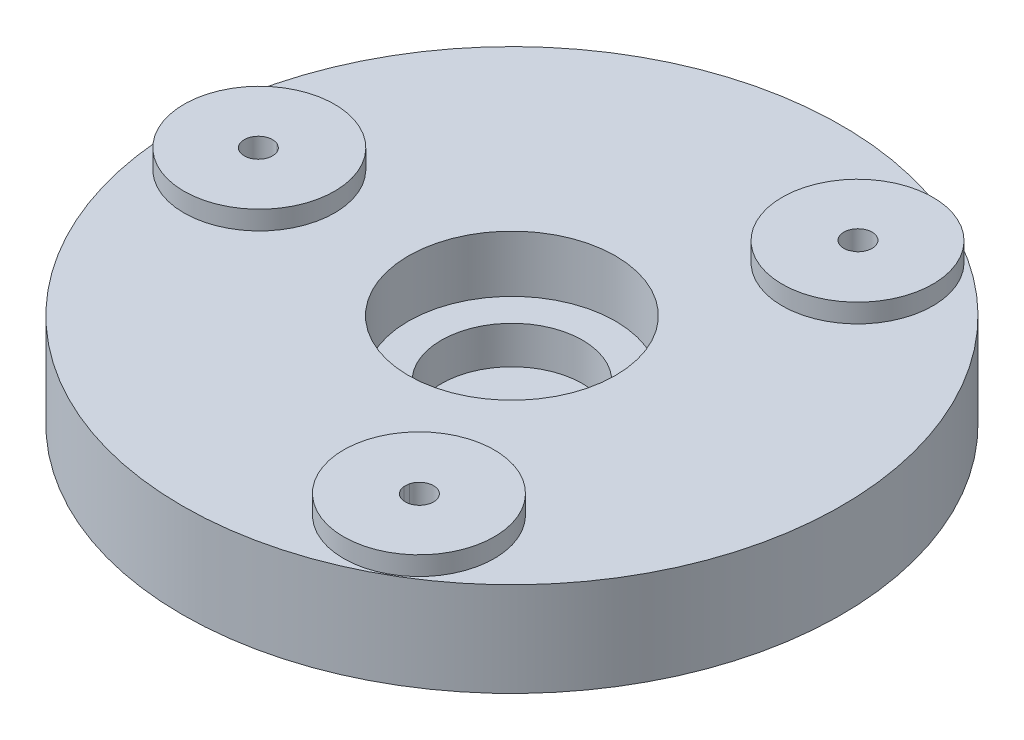
ISO-10303-21;
HEADER;
FILE_DESCRIPTION(('STEP AP214'),'2;1');
FILE_NAME('part.step','',(''),(''),'','','');
FILE_SCHEMA(('AUTOMOTIVE_DESIGN { 1 0 10303 214 1 1 1 1 }'));
ENDSEC;
DATA;
#1=APPLICATION_CONTEXT('core data for automotive mechanical design processes');
#2=APPLICATION_PROTOCOL_DEFINITION('international standard','automotive_design',2000,#1);
#3=PRODUCT_CONTEXT('',#1,'mechanical');
#4=PRODUCT('Part','Part','',(#3));
#5=PRODUCT_RELATED_PRODUCT_CATEGORY('part','',(#4));
#6=PRODUCT_DEFINITION_FORMATION('','',#4);
#7=PRODUCT_DEFINITION_CONTEXT('part definition',#1,'design');
#8=PRODUCT_DEFINITION('design','',#6,#7);
#9=PRODUCT_DEFINITION_SHAPE('','',#8);
#10=(LENGTH_UNIT() NAMED_UNIT(*) SI_UNIT(.MILLI.,.METRE.));
#11=(NAMED_UNIT(*) PLANE_ANGLE_UNIT() SI_UNIT($,.RADIAN.));
#12=(NAMED_UNIT(*) SI_UNIT($,.STERADIAN.) SOLID_ANGLE_UNIT());
#13=UNCERTAINTY_MEASURE_WITH_UNIT(LENGTH_MEASURE(1.E-05),#10,'distance_accuracy_value','');
#14=(GEOMETRIC_REPRESENTATION_CONTEXT(3) GLOBAL_UNCERTAINTY_ASSIGNED_CONTEXT((#13)) GLOBAL_UNIT_ASSIGNED_CONTEXT((#10,
#11,#12)) REPRESENTATION_CONTEXT('',''));
#15=CARTESIAN_POINT('',(0.,0.,0.));
#16=DIRECTION('',(0.,0.,1.));
#17=DIRECTION('',(1.,0.,0.));
#18=AXIS2_PLACEMENT_3D('',#15,#16,#17);
#19=CARTESIAN_POINT('',(0.,-20.,0.));
#20=DIRECTION('',(0.,1.,0.));
#21=DIRECTION('',(0.,0.,1.));
#22=AXIS2_PLACEMENT_3D('',#19,#20,#21);
#23=CYLINDRICAL_SURFACE('',#22,8.96564527824996);
#24=CARTESIAN_POINT('',(0.,-20.,0.));
#25=DIRECTION('',(0.,-1.,0.));
#26=DIRECTION('',(0.,0.,-1.));
#27=AXIS2_PLACEMENT_3D('',#24,#25,#26);
#28=CIRCLE('',#27,8.96564527824996);
#29=CARTESIAN_POINT('',(8.90970231014515,-20.,1.));
#30=VERTEX_POINT('',#29);
#31=CARTESIAN_POINT('',(8.90970231014515,-20.,-1.));
#32=VERTEX_POINT('',#31);
#33=EDGE_CURVE('E62',#30,#32,#28,.T.);
#34=ORIENTED_EDGE('',*,*,#33,.F.);
#35=DIRECTION('',(0.,1.,0.));
#36=VECTOR('',#35,1.);
#37=CARTESIAN_POINT('',(8.90970231014515,-20.,1.));
#38=LINE('',#37,#36);
#39=CARTESIAN_POINT('',(8.90970231014515,-10.,1.));
#40=VERTEX_POINT('',#39);
#41=EDGE_CURVE('E120',#30,#40,#38,.T.);
#42=ORIENTED_EDGE('',*,*,#41,.T.);
#43=CARTESIAN_POINT('',(0.,-10.,0.));
#44=DIRECTION('',(0.,-1.,0.));
#45=DIRECTION('',(0.,0.,-1.));
#46=AXIS2_PLACEMENT_3D('',#43,#44,#45);
#47=CIRCLE('',#46,8.96564527824996);
#48=CARTESIAN_POINT('',(8.90970231014515,-10.,-1.));
#49=VERTEX_POINT('',#48);
#50=EDGE_CURVE('E122',#40,#49,#47,.T.);
#51=ORIENTED_EDGE('',*,*,#50,.T.);
#52=DIRECTION('',(0.,1.,0.));
#53=VECTOR('',#52,1.);
#54=CARTESIAN_POINT('',(8.90970231014515,-20.,-1.));
#55=LINE('',#54,#53);
#56=EDGE_CURVE('E69',#49,#32,#55,.F.);
#57=ORIENTED_EDGE('',*,*,#56,.T.);
#58=EDGE_LOOP('',(#34,#42,#51,#57));
#59=FACE_BOUND('',#58,.T.);
#60=ADVANCED_FACE('F55',(#59),#23,.T.);
#61=CARTESIAN_POINT('',(0.,-20.,0.));
#62=DIRECTION('',(0.,-1.,0.));
#63=DIRECTION('',(0.,0.,-1.));
#64=AXIS2_PLACEMENT_3D('',#61,#62,#63);
#65=PLANE('',#64);
#66=DIRECTION('',(-1.,0.,0.));
#67=VECTOR('',#66,1.);
#68=CARTESIAN_POINT('',(9.96564527824996,-20.,1.));
#69=LINE('',#68,#67);
#70=CARTESIAN_POINT('',(7.96564527824996,-20.,1.));
#71=VERTEX_POINT('',#70);
#72=EDGE_CURVE('E111',#30,#71,#69,.T.);
#73=ORIENTED_EDGE('',*,*,#72,.F.);
#74=ORIENTED_EDGE('',*,*,#33,.T.);
#75=DIRECTION('',(1.,0.,0.));
#76=VECTOR('',#75,1.);
#77=CARTESIAN_POINT('',(9.96564527824996,-20.,-1.));
#78=LINE('',#77,#76);
#79=CARTESIAN_POINT('',(7.96564527824996,-20.,-1.));
#80=VERTEX_POINT('',#79);
#81=EDGE_CURVE('E113',#80,#32,#78,.T.);
#82=ORIENTED_EDGE('',*,*,#81,.F.);
#83=DIRECTION('',(0.,0.,-1.));
#84=VECTOR('',#83,1.);
#85=CARTESIAN_POINT('',(7.96564527824996,-20.,-1.));
#86=LINE('',#85,#84);
#87=EDGE_CURVE('E100',#71,#80,#86,.T.);
#88=ORIENTED_EDGE('',*,*,#87,.F.);
#89=EDGE_LOOP('',(#73,#74,#82,#88));
#90=FACE_BOUND('',#89,.T.);
#91=ADVANCED_FACE('F129',(#90),#65,.T.);
#92=CARTESIAN_POINT('',(0.,-10.,0.));
#93=DIRECTION('',(0.,-1.,0.));
#94=DIRECTION('',(0.,0.,-1.));
#95=AXIS2_PLACEMENT_3D('',#92,#93,#94);
#96=PLANE('',#95);
#97=ORIENTED_EDGE('',*,*,#50,.F.);
#98=DIRECTION('',(-1.,0.,0.));
#99=VECTOR('',#98,1.);
#100=CARTESIAN_POINT('',(0.,-10.,1.));
#101=LINE('',#100,#99);
#102=CARTESIAN_POINT('',(7.96564527824996,-10.,1.));
#103=VERTEX_POINT('',#102);
#104=EDGE_CURVE('E12',#40,#103,#101,.T.);
#105=ORIENTED_EDGE('',*,*,#104,.T.);
#106=DIRECTION('',(0.,0.,-1.));
#107=VECTOR('',#106,1.);
#108=CARTESIAN_POINT('',(7.96564527824996,-10.,-1.));
#109=LINE('',#108,#107);
#110=CARTESIAN_POINT('',(7.96564527824996,-10.,-1.));
#111=VERTEX_POINT('',#110);
#112=EDGE_CURVE('E98',#103,#111,#109,.T.);
#113=ORIENTED_EDGE('',*,*,#112,.T.);
#114=DIRECTION('',(1.,0.,0.));
#115=VECTOR('',#114,1.);
#116=CARTESIAN_POINT('',(9.96564527824996,-10.,-1.));
#117=LINE('',#116,#115);
#118=EDGE_CURVE('E103',#111,#49,#117,.T.);
#119=ORIENTED_EDGE('',*,*,#118,.T.);
#120=EDGE_LOOP('',(#97,#105,#113,#119));
#121=FACE_BOUND('',#120,.T.);
#122=ADVANCED_FACE('F110',(#121),#96,.F.);
#123=CARTESIAN_POINT('',(9.96564527824996,-10.,1.));
#124=DIRECTION('',(0.,0.,1.));
#125=DIRECTION('',(1.,0.,0.));
#126=AXIS2_PLACEMENT_3D('',#123,#124,#125);
#127=PLANE('',#126);
#128=ORIENTED_EDGE('',*,*,#72,.T.);
#129=DIRECTION('',(0.,-1.,0.));
#130=VECTOR('',#129,1.);
#131=CARTESIAN_POINT('',(7.96564527824996,-10.,1.));
#132=LINE('',#131,#130);
#133=EDGE_CURVE('E102',#103,#71,#132,.T.);
#134=ORIENTED_EDGE('',*,*,#133,.F.);
#135=ORIENTED_EDGE('',*,*,#104,.F.);
#136=ORIENTED_EDGE('',*,*,#41,.F.);
#137=EDGE_LOOP('',(#128,#134,#135,#136));
#138=FACE_BOUND('',#137,.T.);
#139=ADVANCED_FACE('F127',(#138),#127,.F.);
#140=CARTESIAN_POINT('',(9.96564527824996,-10.,-1.));
#141=DIRECTION('',(0.,0.,-1.));
#142=DIRECTION('',(-1.,0.,0.));
#143=AXIS2_PLACEMENT_3D('',#140,#141,#142);
#144=PLANE('',#143);
#145=ORIENTED_EDGE('',*,*,#118,.F.);
#146=DIRECTION('',(0.,-1.,0.));
#147=VECTOR('',#146,1.);
#148=CARTESIAN_POINT('',(7.96564527824996,-10.,-1.));
#149=LINE('',#148,#147);
#150=EDGE_CURVE('E94',#111,#80,#149,.T.);
#151=ORIENTED_EDGE('',*,*,#150,.T.);
#152=ORIENTED_EDGE('',*,*,#81,.T.);
#153=ORIENTED_EDGE('',*,*,#56,.F.);
#154=EDGE_LOOP('',(#145,#151,#152,#153));
#155=FACE_BOUND('',#154,.T.);
#156=ADVANCED_FACE('F105',(#155),#144,.F.);
#157=CARTESIAN_POINT('',(7.96564527824996,-10.,-1.));
#158=DIRECTION('',(-1.,0.,0.));
#159=DIRECTION('',(0.,0.,1.));
#160=AXIS2_PLACEMENT_3D('',#157,#158,#159);
#161=PLANE('',#160);
#162=ORIENTED_EDGE('',*,*,#87,.T.);
#163=ORIENTED_EDGE('',*,*,#150,.F.);
#164=ORIENTED_EDGE('',*,*,#112,.F.);
#165=ORIENTED_EDGE('',*,*,#133,.T.);
#166=EDGE_LOOP('',(#162,#163,#164,#165));
#167=FACE_BOUND('',#166,.T.);
#168=ADVANCED_FACE('F95',(#167),#161,.F.);
#169=CLOSED_SHELL('',(#60,#91,#122,#139,#156,#168));
#170=MANIFOLD_SOLID_BREP('B2',#169);
#171=CARTESIAN_POINT('',(-26.906498574434,-19.,0.0179362867608335));
#172=DIRECTION('',(0.,1.,0.));
#173=DIRECTION('',(0.,0.,1.));
#174=AXIS2_PLACEMENT_3D('',#171,#172,#173);
#175=CYLINDRICAL_SURFACE('',#174,1.5);
#176=CARTESIAN_POINT('',(-26.906498574434,-6.00000000000001,0.0179362867608335));
#177=DIRECTION('',(0.,-1.,0.));
#178=DIRECTION('',(0.,0.,-1.));
#179=AXIS2_PLACEMENT_3D('',#176,#177,#178);
#180=CIRCLE('',#179,1.5);
#181=CARTESIAN_POINT('',(-26.2764467646304,-6.00000000000001,-1.34332589113262));
#182=VERTEX_POINT('',#181);
#183=CARTESIAN_POINT('',(-25.8571119358385,-6.00000000000001,-1.05387884782966));
#184=VERTEX_POINT('',#183);
#185=EDGE_CURVE('E192',#182,#184,#180,.F.);
#186=ORIENTED_EDGE('',*,*,#185,.F.);
#187=DIRECTION('',(0.,1.,0.));
#188=VECTOR('',#187,1.);
#189=CARTESIAN_POINT('',(-26.2764467646304,-19.,-1.34332589113262));
#190=LINE('',#189,#188);
#191=CARTESIAN_POINT('',(-26.2764467646304,2.,-1.34332589113262));
#192=VERTEX_POINT('',#191);
#193=EDGE_CURVE('E266',#182,#192,#190,.T.);
#194=ORIENTED_EDGE('',*,*,#193,.T.);
#195=CARTESIAN_POINT('',(-26.906498574434,2.,0.0179362867608335));
#196=DIRECTION('',(0.,1.,0.));
#197=DIRECTION('',(0.866025403784436,0.,-0.500000000000004));
#198=AXIS2_PLACEMENT_3D('',#195,#196,#197);
#199=CIRCLE('',#198,1.5);
#200=CARTESIAN_POINT('',(-25.8571119358385,2.,-1.05387884782966));
#201=VERTEX_POINT('',#200);
#202=EDGE_CURVE('E244',#192,#201,#199,.T.);
#203=ORIENTED_EDGE('',*,*,#202,.T.);
#204=DIRECTION('',(0.,1.,0.));
#205=VECTOR('',#204,1.);
#206=CARTESIAN_POINT('',(-25.8571119358385,-19.,-1.05387884782966));
#207=LINE('',#206,#205);
#208=EDGE_CURVE('E700',#184,#201,#207,.T.);
#209=ORIENTED_EDGE('',*,*,#208,.F.);
#210=EDGE_LOOP('',(#186,#194,#203,#209));
#211=FACE_BOUND('',#210,.T.);
#212=ADVANCED_FACE('F178',(#211),#175,.F.);
#213=CARTESIAN_POINT('',(-7.85137258717134,-19.,11.3746333078864));
#214=DIRECTION('',(-0.568066221964961,0.,0.822982847611331));
#215=DIRECTION('',(0.822982847611331,0.,0.568066221964961));
#216=AXIS2_PLACEMENT_3D('',#213,#214,#215);
#217=PLANE('',#216);
#218=ORIENTED_EDGE('',*,*,#193,.F.);
#219=DIRECTION('',(0.822982847611331,0.,0.568066221964961));
#220=VECTOR('',#219,1.);
#221=CARTESIAN_POINT('',(-7.85137258717134,-6.00000000000001,11.3746333078864));
#222=LINE('',#221,#220);
#223=EDGE_CURVE('E53',#182,#184,#222,.T.);
#224=ORIENTED_EDGE('',*,*,#223,.T.);
#225=ORIENTED_EDGE('',*,*,#208,.T.);
#226=DIRECTION('',(0.822982847611331,0.,0.568066221964961));
#227=VECTOR('',#226,1.);
#228=CARTESIAN_POINT('',(-7.85137258717134,2.,11.3746333078864));
#229=LINE('',#228,#227);
#230=EDGE_CURVE('E247',#192,#201,#229,.T.);
#231=ORIENTED_EDGE('',*,*,#230,.F.);
#232=EDGE_LOOP('',(#218,#224,#225,#231));
#233=FACE_BOUND('',#232,.T.);
#234=ADVANCED_FACE('F355',(#233),#217,.T.);
#235=CARTESIAN_POINT('',(13.4687825672016,-19.,23.2927431489692));
#236=DIRECTION('',(0.,1.,0.));
#237=DIRECTION('',(0.,0.,1.));
#238=AXIS2_PLACEMENT_3D('',#235,#236,#237);
#239=CYLINDRICAL_SURFACE('',#238,1.5);
#240=CARTESIAN_POINT('',(13.4687825672016,-6.00000000000001,23.2927431489692));
#241=DIRECTION('',(0.,-1.,0.));
#242=DIRECTION('',(0.,0.,-1.));
#243=AXIS2_PLACEMENT_3D('',#240,#241,#242);
#244=CIRCLE('',#243,1.5);
#245=CARTESIAN_POINT('',(11.9748690350331,-6.00000000000001,23.4277333649256));
#246=VERTEX_POINT('',#245);
#247=CARTESIAN_POINT('',(12.0158701131878,-6.00000000000001,22.9198552288487));
#248=VERTEX_POINT('',#247);
#249=EDGE_CURVE('E198',#246,#248,#244,.F.);
#250=ORIENTED_EDGE('',*,*,#249,.F.);
#251=DIRECTION('',(0.,1.,0.));
#252=VECTOR('',#251,1.);
#253=CARTESIAN_POINT('',(11.9748690350331,-19.,23.4277333649256));
#254=LINE('',#253,#252);
#255=CARTESIAN_POINT('',(11.9748690350331,2.,23.4277333649256));
#256=VERTEX_POINT('',#255);
#257=EDGE_CURVE('E235',#246,#256,#254,.T.);
#258=ORIENTED_EDGE('',*,*,#257,.T.);
#259=CARTESIAN_POINT('',(13.4687825672016,2.,23.2927431489692));
#260=DIRECTION('',(0.,1.,0.));
#261=DIRECTION('',(-0.866025403784443,0.,-0.499999999999992));
#262=AXIS2_PLACEMENT_3D('',#259,#260,#261);
#263=CIRCLE('',#262,1.5);
#264=CARTESIAN_POINT('',(12.0158701131878,2.,22.9198552288487));
#265=VERTEX_POINT('',#264);
#266=EDGE_CURVE('E695',#256,#265,#263,.T.);
#267=ORIENTED_EDGE('',*,*,#266,.T.);
#268=DIRECTION('',(0.,1.,0.));
#269=VECTOR('',#268,1.);
#270=CARTESIAN_POINT('',(12.0158701131878,-19.,22.9198552288487));
#271=LINE('',#270,#269);
#272=EDGE_CURVE('E237',#248,#265,#271,.T.);
#273=ORIENTED_EDGE('',*,*,#272,.F.);
#274=EDGE_LOOP('',(#250,#258,#267,#273));
#275=FACE_BOUND('',#274,.T.);
#276=ADVANCED_FACE('F233',(#275),#239,.F.);
#277=CARTESIAN_POINT('',(13.7764076969479,-19.,1.11217146112389));
#278=DIRECTION('',(0.996757163892751,0.,0.0804683554478362));
#279=DIRECTION('',(0.0804683554478362,0.,-0.996757163892751));
#280=AXIS2_PLACEMENT_3D('',#277,#278,#279);
#281=PLANE('',#280);
#282=ORIENTED_EDGE('',*,*,#257,.F.);
#283=DIRECTION('',(0.0804683554478362,0.,-0.996757163892751));
#284=VECTOR('',#283,1.);
#285=CARTESIAN_POINT('',(13.7764076969479,-6.00000000000001,1.11217146112389));
#286=LINE('',#285,#284);
#287=EDGE_CURVE('E186',#246,#248,#286,.T.);
#288=ORIENTED_EDGE('',*,*,#287,.T.);
#289=ORIENTED_EDGE('',*,*,#272,.T.);
#290=DIRECTION('',(0.0804683554478362,0.,-0.996757163892751));
#291=VECTOR('',#290,1.);
#292=CARTESIAN_POINT('',(13.7764076969479,2.,1.11217146112389));
#293=LINE('',#292,#291);
#294=EDGE_CURVE('E242',#256,#265,#293,.T.);
#295=ORIENTED_EDGE('',*,*,#294,.F.);
#296=EDGE_LOOP('',(#282,#288,#289,#295));
#297=FACE_BOUND('',#296,.T.);
#298=ADVANCED_FACE('F240',(#297),#281,.T.);
#299=CARTESIAN_POINT('',(13.4377160072327,-19.,-23.31067943573));
#300=DIRECTION('',(0.,1.,0.));
#301=DIRECTION('',(0.,0.,1.));
#302=AXIS2_PLACEMENT_3D('',#299,#300,#301);
#303=CYLINDRICAL_SURFACE('',#302,1.5);
#304=CARTESIAN_POINT('',(13.4377160072327,-6.00000000000001,-23.31067943573));
#305=DIRECTION('',(0.,-1.,0.));
#306=DIRECTION('',(0.,0.,-1.));
#307=AXIS2_PLACEMENT_3D('',#304,#305,#306);
#308=CIRCLE('',#307,1.5);
#309=CARTESIAN_POINT('',(14.3015777295975,-6.00000000000001,-22.084407473793));
#310=VERTEX_POINT('',#309);
#311=CARTESIAN_POINT('',(13.8412418226509,-6.00000000000001,-21.8659763810191));
#312=VERTEX_POINT('',#311);
#313=EDGE_CURVE('E270',#310,#312,#308,.F.);
#314=ORIENTED_EDGE('',*,*,#313,.F.);
#315=DIRECTION('',(0.,1.,0.));
#316=VECTOR('',#315,1.);
#317=CARTESIAN_POINT('',(14.3015777295975,-19.,-22.084407473793));
#318=LINE('',#317,#316);
#319=CARTESIAN_POINT('',(14.3015777295975,2.,-22.084407473793));
#320=VERTEX_POINT('',#319);
#321=EDGE_CURVE('E281',#310,#320,#318,.T.);
#322=ORIENTED_EDGE('',*,*,#321,.T.);
#323=CARTESIAN_POINT('',(13.4377160072327,2.,-23.31067943573));
#324=DIRECTION('',(0.,1.,0.));
#325=DIRECTION('',(0.,0.,1.));
#326=AXIS2_PLACEMENT_3D('',#323,#324,#325);
#327=CIRCLE('',#326,1.5);
#328=CARTESIAN_POINT('',(13.8412418226509,2.,-21.8659763810191));
#329=VERTEX_POINT('',#328);
#330=EDGE_CURVE('E274',#320,#329,#327,.T.);
#331=ORIENTED_EDGE('',*,*,#330,.T.);
#332=DIRECTION('',(0.,1.,0.));
#333=VECTOR('',#332,1.);
#334=CARTESIAN_POINT('',(13.8412418226509,-19.,-21.8659763810191));
#335=LINE('',#334,#333);
#336=EDGE_CURVE('E280',#312,#329,#335,.T.);
#337=ORIENTED_EDGE('',*,*,#336,.F.);
#338=EDGE_LOOP('',(#314,#322,#331,#337));
#339=FACE_BOUND('',#338,.T.);
#340=ADVANCED_FACE('F317',(#339),#303,.F.);
#341=CARTESIAN_POINT('',(-5.92503510977647,-19.,-12.4868047690103));
#342=DIRECTION('',(-0.428690941927785,0.,-0.903451203059174));
#343=DIRECTION('',(-0.903451203059174,0.,0.428690941927785));
#344=AXIS2_PLACEMENT_3D('',#341,#342,#343);
#345=PLANE('',#344);
#346=ORIENTED_EDGE('',*,*,#321,.F.);
#347=DIRECTION('',(-0.903451203059174,0.,0.428690941927785));
#348=VECTOR('',#347,1.);
#349=CARTESIAN_POINT('',(-5.92503510977647,-6.00000000000001,-12.4868047690103));
#350=LINE('',#349,#348);
#351=EDGE_CURVE('E231',#310,#312,#350,.T.);
#352=ORIENTED_EDGE('',*,*,#351,.T.);
#353=ORIENTED_EDGE('',*,*,#336,.T.);
#354=DIRECTION('',(-0.903451203059174,0.,0.428690941927785));
#355=VECTOR('',#354,1.);
#356=CARTESIAN_POINT('',(-5.92503510977647,2.,-12.4868047690103));
#357=LINE('',#356,#355);
#358=EDGE_CURVE('E277',#320,#329,#357,.T.);
#359=ORIENTED_EDGE('',*,*,#358,.F.);
#360=EDGE_LOOP('',(#346,#352,#353,#359));
#361=FACE_BOUND('',#360,.T.);
#362=ADVANCED_FACE('F312',(#361),#345,.T.);
#363=CARTESIAN_POINT('',(0.,-10.,0.));
#364=DIRECTION('',(0.,1.,0.));
#365=DIRECTION('',(0.,0.,1.));
#366=AXIS2_PLACEMENT_3D('',#363,#364,#365);
#367=CYLINDRICAL_SURFACE('',#366,35.);
#368=CARTESIAN_POINT('',(0.,-10.,0.));
#369=DIRECTION('',(0.,1.,0.));
#370=DIRECTION('',(0.,0.,1.));
#371=AXIS2_PLACEMENT_3D('',#368,#369,#370);
#372=CIRCLE('',#371,35.);
#373=CARTESIAN_POINT('',(0.,-10.,35.));
#374=VERTEX_POINT('',#373);
#375=EDGE_CURVE('E301',#374,#374,#372,.T.);
#376=ORIENTED_EDGE('',*,*,#375,.T.);
#377=EDGE_LOOP('',(#376));
#378=FACE_BOUND('',#377,.T.);
#379=CARTESIAN_POINT('',(0.,0.,0.));
#380=DIRECTION('',(0.,1.,0.));
#381=DIRECTION('',(0.,0.,1.));
#382=AXIS2_PLACEMENT_3D('',#379,#380,#381);
#383=CIRCLE('',#382,35.);
#384=CARTESIAN_POINT('',(0.,0.,35.));
#385=VERTEX_POINT('',#384);
#386=EDGE_CURVE('E297',#385,#385,#383,.T.);
#387=ORIENTED_EDGE('',*,*,#386,.F.);
#388=EDGE_LOOP('',(#387));
#389=FACE_BOUND('',#388,.T.);
#390=ADVANCED_FACE('F180',(#378,#389),#367,.T.);
#391=CARTESIAN_POINT('',(0.,-10.,0.));
#392=DIRECTION('',(0.,1.,0.));
#393=DIRECTION('',(0.,0.,1.));
#394=AXIS2_PLACEMENT_3D('',#391,#392,#393);
#395=PLANE('',#394);
#396=CARTESIAN_POINT('',(0.0179362867609341,-10.,26.906498574434));
#397=DIRECTION('',(0.,-1.,0.));
#398=DIRECTION('',(0.500000000000007,0.,0.866025403784435));
#399=AXIS2_PLACEMENT_3D('',#396,#397,#398);
#400=CIRCLE('',#399,3.1);
#401=CARTESIAN_POINT('',(1.56793628676096,-10.,29.5911773261658));
#402=VERTEX_POINT('',#401);
#403=EDGE_CURVE('E651',#402,#402,#400,.T.);
#404=ORIENTED_EDGE('',*,*,#403,.F.);
#405=EDGE_LOOP('',(#404));
#406=FACE_BOUND('',#405,.T.);
#407=CARTESIAN_POINT('',(-23.31067943573,-10.,-13.4377160072326));
#408=DIRECTION('',(0.,-1.,0.));
#409=DIRECTION('',(-1.,0.,0.));
#410=AXIS2_PLACEMENT_3D('',#407,#408,#409);
#411=CIRCLE('',#410,3.1);
#412=CARTESIAN_POINT('',(-26.41067943573,-10.,-13.4377160072326));
#413=VERTEX_POINT('',#412);
#414=EDGE_CURVE('E650',#413,#413,#411,.T.);
#415=ORIENTED_EDGE('',*,*,#414,.F.);
#416=EDGE_LOOP('',(#415));
#417=FACE_BOUND('',#416,.T.);
#418=CARTESIAN_POINT('',(23.3106794357301,-10.,13.4377160072324));
#419=DIRECTION('',(0.,-1.,0.));
#420=DIRECTION('',(1.,0.,0.));
#421=AXIS2_PLACEMENT_3D('',#418,#419,#420);
#422=CIRCLE('',#421,3.1);
#423=CARTESIAN_POINT('',(26.4106794357301,-10.,13.4377160072324));
#424=VERTEX_POINT('',#423);
#425=EDGE_CURVE('E660',#424,#424,#422,.T.);
#426=ORIENTED_EDGE('',*,*,#425,.F.);
#427=EDGE_LOOP('',(#426));
#428=FACE_BOUND('',#427,.T.);
#429=CARTESIAN_POINT('',(-23.2927431489692,-10.,13.4687825672015));
#430=DIRECTION('',(0.,-1.,0.));
#431=DIRECTION('',(-0.499999999999995,0.,0.866025403784441));
#432=AXIS2_PLACEMENT_3D('',#429,#430,#431);
#433=CIRCLE('',#432,3.1);
#434=CARTESIAN_POINT('',(-24.8427431489692,-10.,16.1534613189332));
#435=VERTEX_POINT('',#434);
#436=EDGE_CURVE('E665',#435,#435,#433,.T.);
#437=ORIENTED_EDGE('',*,*,#436,.F.);
#438=EDGE_LOOP('',(#437));
#439=FACE_BOUND('',#438,.T.);
#440=CARTESIAN_POINT('',(-26.906498574434,-10.,0.0179362867608335));
#441=DIRECTION('',(0.,-1.,0.));
#442=DIRECTION('',(-0.866025403784436,0.,0.500000000000004));
#443=AXIS2_PLACEMENT_3D('',#440,#441,#442);
#444=CIRCLE('',#443,3.1);
#445=CARTESIAN_POINT('',(-29.5911773261658,-10.,1.56793628676085));
#446=VERTEX_POINT('',#445);
#447=EDGE_CURVE('E676',#446,#446,#444,.T.);
#448=ORIENTED_EDGE('',*,*,#447,.F.);
#449=EDGE_LOOP('',(#448));
#450=FACE_BOUND('',#449,.T.);
#451=CARTESIAN_POINT('',(13.4687825672016,-10.,23.2927431489692));
#452=DIRECTION('',(0.,-1.,0.));
#453=DIRECTION('',(0.866025403784443,0.,0.499999999999992));
#454=AXIS2_PLACEMENT_3D('',#451,#452,#453);
#455=CIRCLE('',#454,3.1);
#456=CARTESIAN_POINT('',(16.1534613189333,-10.,24.8427431489691));
#457=VERTEX_POINT('',#456);
#458=EDGE_CURVE('E671',#457,#457,#455,.T.);
#459=ORIENTED_EDGE('',*,*,#458,.F.);
#460=EDGE_LOOP('',(#459));
#461=FACE_BOUND('',#460,.T.);
#462=CARTESIAN_POINT('',(23.2927431489693,-10.,-13.4687825672013));
#463=DIRECTION('',(0.,-1.,0.));
#464=DIRECTION('',(0.500000000000001,0.,-0.866025403784438));
#465=AXIS2_PLACEMENT_3D('',#462,#463,#464);
#466=CIRCLE('',#465,3.1);
#467=CARTESIAN_POINT('',(24.8427431489693,-10.,-16.1534613189331));
#468=VERTEX_POINT('',#467);
#469=EDGE_CURVE('E685',#468,#468,#466,.T.);
#470=ORIENTED_EDGE('',*,*,#469,.F.);
#471=EDGE_LOOP('',(#470));
#472=FACE_BOUND('',#471,.T.);
#473=CARTESIAN_POINT('',(-0.0179362867607329,-10.,-26.906498574434));
#474=DIRECTION('',(0.,-1.,0.));
#475=DIRECTION('',(-0.500000000000001,0.,-0.866025403784438));
#476=AXIS2_PLACEMENT_3D('',#473,#474,#475);
#477=CIRCLE('',#476,3.1);
#478=CARTESIAN_POINT('',(-1.56793628676074,-10.,-29.5911773261658));
#479=VERTEX_POINT('',#478);
#480=EDGE_CURVE('E689',#479,#479,#477,.T.);
#481=ORIENTED_EDGE('',*,*,#480,.F.);
#482=EDGE_LOOP('',(#481));
#483=FACE_BOUND('',#482,.T.);
#484=CARTESIAN_POINT('',(13.4377160072327,-10.,-23.31067943573));
#485=DIRECTION('',(0.,-1.,0.));
#486=DIRECTION('',(0.,0.,-1.));
#487=AXIS2_PLACEMENT_3D('',#484,#485,#486);
#488=CIRCLE('',#487,3.1);
#489=CARTESIAN_POINT('',(13.4377160072327,-10.,-26.41067943573));
#490=VERTEX_POINT('',#489);
#491=EDGE_CURVE('E256',#490,#490,#488,.T.);
#492=ORIENTED_EDGE('',*,*,#491,.F.);
#493=EDGE_LOOP('',(#492));
#494=FACE_BOUND('',#493,.T.);
#495=CARTESIAN_POINT('',(0.,-10.,0.));
#496=DIRECTION('',(0.,-1.,0.));
#497=DIRECTION('',(0.,0.,-1.));
#498=AXIS2_PLACEMENT_3D('',#495,#496,#497);
#499=CIRCLE('',#498,7.5);
#500=CARTESIAN_POINT('',(0.,-10.,-7.5));
#501=VERTEX_POINT('',#500);
#502=EDGE_CURVE('E288',#501,#501,#499,.T.);
#503=ORIENTED_EDGE('',*,*,#502,.F.);
#504=EDGE_LOOP('',(#503));
#505=FACE_BOUND('',#504,.T.);
#506=ORIENTED_EDGE('',*,*,#375,.F.);
#507=EDGE_LOOP('',(#506));
#508=FACE_BOUND('',#507,.T.);
#509=ADVANCED_FACE('F338',(#406,#417,#428,#439,#450,#461,#472,#483,#494,#505,#508),#395,.F.);
#510=CARTESIAN_POINT('',(0.,0.,0.));
#511=DIRECTION('',(0.,1.,0.));
#512=DIRECTION('',(0.,0.,1.));
#513=AXIS2_PLACEMENT_3D('',#510,#511,#512);
#514=PLANE('',#513);
#515=CARTESIAN_POINT('',(-26.8595374461574,0.,-0.0303611611849868));
#516=DIRECTION('',(0.,1.,0.));
#517=DIRECTION('',(0.866025403784436,0.,-0.500000000000004));
#518=AXIS2_PLACEMENT_3D('',#515,#516,#517);
#519=CIRCLE('',#518,8.);
#520=CARTESIAN_POINT('',(-19.9313342158819,0.,-4.03036116118502));
#521=VERTEX_POINT('',#520);
#522=EDGE_CURVE('E257',#521,#521,#519,.T.);
#523=ORIENTED_EDGE('',*,*,#522,.F.);
#524=EDGE_LOOP('',(#523));
#525=FACE_BOUND('',#524,.T.);
#526=CARTESIAN_POINT('',(13.4034751862042,0.,23.2762223428642));
#527=DIRECTION('',(0.,1.,0.));
#528=DIRECTION('',(-0.866025403784443,0.,-0.499999999999992));
#529=AXIS2_PLACEMENT_3D('',#526,#527,#528);
#530=CIRCLE('',#529,8.);
#531=CARTESIAN_POINT('',(6.47527195592868,0.,19.2762223428642));
#532=VERTEX_POINT('',#531);
#533=EDGE_CURVE('E263',#532,#532,#530,.T.);
#534=ORIENTED_EDGE('',*,*,#533,.F.);
#535=EDGE_LOOP('',(#534));
#536=FACE_BOUND('',#535,.T.);
#537=CARTESIAN_POINT('',(13.4560622599534,0.,-23.2458611816792));
#538=DIRECTION('',(0.,1.,0.));
#539=DIRECTION('',(0.,0.,1.));
#540=AXIS2_PLACEMENT_3D('',#537,#538,#539);
#541=CIRCLE('',#540,8.);
#542=CARTESIAN_POINT('',(13.4560622599534,0.,-15.2458611816792));
#543=VERTEX_POINT('',#542);
#544=EDGE_CURVE('E283',#543,#543,#541,.T.);
#545=ORIENTED_EDGE('',*,*,#544,.F.);
#546=EDGE_LOOP('',(#545));
#547=FACE_BOUND('',#546,.T.);
#548=CARTESIAN_POINT('',(0.,0.,0.));
#549=DIRECTION('',(0.,1.,0.));
#550=DIRECTION('',(0.,0.,1.));
#551=AXIS2_PLACEMENT_3D('',#548,#549,#550);
#552=CIRCLE('',#551,11.);
#553=CARTESIAN_POINT('',(0.,0.,11.));
#554=VERTEX_POINT('',#553);
#555=EDGE_CURVE('E298',#554,#554,#552,.T.);
#556=ORIENTED_EDGE('',*,*,#555,.F.);
#557=EDGE_LOOP('',(#556));
#558=FACE_BOUND('',#557,.T.);
#559=ORIENTED_EDGE('',*,*,#386,.T.);
#560=EDGE_LOOP('',(#559));
#561=FACE_BOUND('',#560,.T.);
#562=ADVANCED_FACE('F334',(#525,#536,#547,#558,#561),#514,.T.);
#563=CARTESIAN_POINT('',(0.,-5.99999999999999,0.));
#564=DIRECTION('',(0.,1.,0.));
#565=DIRECTION('',(0.,0.,1.));
#566=AXIS2_PLACEMENT_3D('',#563,#564,#565);
#567=CYLINDRICAL_SURFACE('',#566,11.);
#568=CARTESIAN_POINT('',(0.,-5.99999999999999,0.));
#569=DIRECTION('',(0.,1.,0.));
#570=DIRECTION('',(0.,0.,1.));
#571=AXIS2_PLACEMENT_3D('',#568,#569,#570);
#572=CIRCLE('',#571,11.);
#573=CARTESIAN_POINT('',(0.,-5.99999999999999,11.));
#574=VERTEX_POINT('',#573);
#575=EDGE_CURVE('E294',#574,#574,#572,.T.);
#576=ORIENTED_EDGE('',*,*,#575,.F.);
#577=EDGE_LOOP('',(#576));
#578=FACE_BOUND('',#577,.T.);
#579=ORIENTED_EDGE('',*,*,#555,.T.);
#580=EDGE_LOOP('',(#579));
#581=FACE_BOUND('',#580,.T.);
#582=ADVANCED_FACE('F337',(#578,#581),#567,.F.);
#583=CARTESIAN_POINT('',(0.,-5.99999999999999,0.));
#584=DIRECTION('',(0.,1.,0.));
#585=DIRECTION('',(0.,0.,1.));
#586=AXIS2_PLACEMENT_3D('',#583,#584,#585);
#587=PLANE('',#586);
#588=CARTESIAN_POINT('',(0.,-5.99999999999999,0.));
#589=DIRECTION('',(0.,1.,0.));
#590=DIRECTION('',(0.,0.,1.));
#591=AXIS2_PLACEMENT_3D('',#588,#589,#590);
#592=CIRCLE('',#591,7.5);
#593=CARTESIAN_POINT('',(0.,-5.99999999999999,7.5));
#594=VERTEX_POINT('',#593);
#595=EDGE_CURVE('E293',#594,#594,#592,.T.);
#596=ORIENTED_EDGE('',*,*,#595,.F.);
#597=EDGE_LOOP('',(#596));
#598=FACE_BOUND('',#597,.T.);
#599=ORIENTED_EDGE('',*,*,#575,.T.);
#600=EDGE_LOOP('',(#599));
#601=FACE_BOUND('',#600,.T.);
#602=ADVANCED_FACE('F398',(#598,#601),#587,.T.);
#603=CARTESIAN_POINT('',(0.,-4.00000000000001,0.));
#604=DIRECTION('',(0.,-1.,0.));
#605=DIRECTION('',(0.,0.,-1.));
#606=AXIS2_PLACEMENT_3D('',#603,#604,#605);
#607=CYLINDRICAL_SURFACE('',#606,7.5);
#608=ORIENTED_EDGE('',*,*,#595,.T.);
#609=EDGE_LOOP('',(#608));
#610=FACE_BOUND('',#609,.T.);
#611=ORIENTED_EDGE('',*,*,#502,.T.);
#612=EDGE_LOOP('',(#611));
#613=FACE_BOUND('',#612,.T.);
#614=ADVANCED_FACE('F330',(#610,#613),#607,.F.);
#615=CARTESIAN_POINT('',(13.4560622599534,2.,-23.2458611816792));
#616=DIRECTION('',(0.,-1.,0.));
#617=DIRECTION('',(0.,0.,-1.));
#618=AXIS2_PLACEMENT_3D('',#615,#616,#617);
#619=CYLINDRICAL_SURFACE('',#618,8.);
#620=CARTESIAN_POINT('',(13.4560622599534,2.,-23.2458611816792));
#621=DIRECTION('',(0.,1.,0.));
#622=DIRECTION('',(0.,0.,1.));
#623=AXIS2_PLACEMENT_3D('',#620,#621,#622);
#624=CIRCLE('',#623,8.);
#625=CARTESIAN_POINT('',(13.4560622599534,2.,-15.2458611816792));
#626=VERTEX_POINT('',#625);
#627=EDGE_CURVE('E285',#626,#626,#624,.T.);
#628=ORIENTED_EDGE('',*,*,#627,.F.);
#629=EDGE_LOOP('',(#628));
#630=FACE_BOUND('',#629,.T.);
#631=ORIENTED_EDGE('',*,*,#544,.T.);
#632=EDGE_LOOP('',(#631));
#633=FACE_BOUND('',#632,.T.);
#634=ADVANCED_FACE('F324',(#630,#633),#619,.T.);
#635=CARTESIAN_POINT('',(13.4560622599534,2.,-23.2458611816792));
#636=DIRECTION('',(0.,1.,0.));
#637=DIRECTION('',(0.,0.,1.));
#638=AXIS2_PLACEMENT_3D('',#635,#636,#637);
#639=PLANE('',#638);
#640=ORIENTED_EDGE('',*,*,#330,.F.);
#641=ORIENTED_EDGE('',*,*,#358,.T.);
#642=EDGE_LOOP('',(#640,#641));
#643=FACE_BOUND('',#642,.T.);
#644=ORIENTED_EDGE('',*,*,#627,.T.);
#645=EDGE_LOOP('',(#644));
#646=FACE_BOUND('',#645,.T.);
#647=ADVANCED_FACE('F320',(#643,#646),#639,.T.);
#648=CARTESIAN_POINT('',(13.4377160072327,-6.00000000000001,-23.31067943573));
#649=DIRECTION('',(0.,-1.,0.));
#650=DIRECTION('',(0.,0.,-1.));
#651=AXIS2_PLACEMENT_3D('',#648,#649,#650);
#652=PLANE('',#651);
#653=CARTESIAN_POINT('',(13.4377160072327,-6.00000000000001,-23.31067943573));
#654=DIRECTION('',(0.,-1.,0.));
#655=DIRECTION('',(0.,0.,-1.));
#656=AXIS2_PLACEMENT_3D('',#653,#654,#655);
#657=CIRCLE('',#656,3.1);
#658=CARTESIAN_POINT('',(13.4377160072327,-6.00000000000001,-26.41067943573));
#659=VERTEX_POINT('',#658);
#660=EDGE_CURVE('E267',#659,#659,#657,.T.);
#661=ORIENTED_EDGE('',*,*,#660,.T.);
#662=EDGE_LOOP('',(#661));
#663=FACE_BOUND('',#662,.T.);
#664=ORIENTED_EDGE('',*,*,#313,.T.);
#665=ORIENTED_EDGE('',*,*,#351,.F.);
#666=EDGE_LOOP('',(#664,#665));
#667=FACE_BOUND('',#666,.T.);
#668=ADVANCED_FACE('F323',(#663,#667),#652,.T.);
#669=CARTESIAN_POINT('',(13.4377160072327,-6.00000000000001,-23.31067943573));
#670=DIRECTION('',(0.,-1.,0.));
#671=DIRECTION('',(0.,0.,-1.));
#672=AXIS2_PLACEMENT_3D('',#669,#670,#671);
#673=CYLINDRICAL_SURFACE('',#672,3.1);
#674=ORIENTED_EDGE('',*,*,#660,.F.);
#675=EDGE_LOOP('',(#674));
#676=FACE_BOUND('',#675,.T.);
#677=ORIENTED_EDGE('',*,*,#491,.T.);
#678=EDGE_LOOP('',(#677));
#679=FACE_BOUND('',#678,.T.);
#680=ADVANCED_FACE('F386',(#676,#679),#673,.F.);
#681=CARTESIAN_POINT('',(13.4034751862042,2.,23.2762223428642));
#682=DIRECTION('',(0.,-1.,0.));
#683=DIRECTION('',(0.,0.,-1.));
#684=AXIS2_PLACEMENT_3D('',#681,#682,#683);
#685=CYLINDRICAL_SURFACE('',#684,8.);
#686=CARTESIAN_POINT('',(13.4034751862042,2.,23.2762223428642));
#687=DIRECTION('',(0.,1.,0.));
#688=DIRECTION('',(-0.866025403784443,0.,-0.499999999999992));
#689=AXIS2_PLACEMENT_3D('',#686,#687,#688);
#690=CIRCLE('',#689,8.);
#691=CARTESIAN_POINT('',(6.47527195592868,2.,19.2762223428642));
#692=VERTEX_POINT('',#691);
#693=EDGE_CURVE('E260',#692,#692,#690,.T.);
#694=ORIENTED_EDGE('',*,*,#693,.F.);
#695=EDGE_LOOP('',(#694));
#696=FACE_BOUND('',#695,.T.);
#697=ORIENTED_EDGE('',*,*,#533,.T.);
#698=EDGE_LOOP('',(#697));
#699=FACE_BOUND('',#698,.T.);
#700=ADVANCED_FACE('F382',(#696,#699),#685,.T.);
#701=CARTESIAN_POINT('',(13.4034751862042,2.,23.2762223428642));
#702=DIRECTION('',(0.,1.,0.));
#703=DIRECTION('',(-0.866025403784443,0.,-0.499999999999992));
#704=AXIS2_PLACEMENT_3D('',#701,#702,#703);
#705=PLANE('',#704);
#706=ORIENTED_EDGE('',*,*,#266,.F.);
#707=ORIENTED_EDGE('',*,*,#294,.T.);
#708=EDGE_LOOP('',(#706,#707));
#709=FACE_BOUND('',#708,.T.);
#710=ORIENTED_EDGE('',*,*,#693,.T.);
#711=EDGE_LOOP('',(#710));
#712=FACE_BOUND('',#711,.T.);
#713=ADVANCED_FACE('F378',(#709,#712),#705,.T.);
#714=CARTESIAN_POINT('',(-26.8595374461574,2.,-0.0303611611849868));
#715=DIRECTION('',(0.,-1.,0.));
#716=DIRECTION('',(0.,0.,-1.));
#717=AXIS2_PLACEMENT_3D('',#714,#715,#716);
#718=CYLINDRICAL_SURFACE('',#717,8.);
#719=CARTESIAN_POINT('',(-26.8595374461574,2.,-0.0303611611849868));
#720=DIRECTION('',(0.,1.,0.));
#721=DIRECTION('',(0.866025403784436,0.,-0.500000000000004));
#722=AXIS2_PLACEMENT_3D('',#719,#720,#721);
#723=CIRCLE('',#722,8.);
#724=CARTESIAN_POINT('',(-19.9313342158819,2.,-4.03036116118502));
#725=VERTEX_POINT('',#724);
#726=EDGE_CURVE('E253',#725,#725,#723,.T.);
#727=ORIENTED_EDGE('',*,*,#726,.F.);
#728=EDGE_LOOP('',(#727));
#729=FACE_BOUND('',#728,.T.);
#730=ORIENTED_EDGE('',*,*,#522,.T.);
#731=EDGE_LOOP('',(#730));
#732=FACE_BOUND('',#731,.T.);
#733=ADVANCED_FACE('F374',(#729,#732),#718,.T.);
#734=CARTESIAN_POINT('',(-26.8595374461574,2.,-0.0303611611849868));
#735=DIRECTION('',(0.,1.,0.));
#736=DIRECTION('',(0.866025403784436,0.,-0.500000000000004));
#737=AXIS2_PLACEMENT_3D('',#734,#735,#736);
#738=PLANE('',#737);
#739=ORIENTED_EDGE('',*,*,#202,.F.);
#740=ORIENTED_EDGE('',*,*,#230,.T.);
#741=EDGE_LOOP('',(#739,#740));
#742=FACE_BOUND('',#741,.T.);
#743=ORIENTED_EDGE('',*,*,#726,.T.);
#744=EDGE_LOOP('',(#743));
#745=FACE_BOUND('',#744,.T.);
#746=ADVANCED_FACE('F370',(#742,#745),#738,.T.);
#747=CARTESIAN_POINT('',(-0.0179362867607329,-6.00000000000001,-26.906498574434));
#748=DIRECTION('',(0.,-1.,0.));
#749=DIRECTION('',(0.,0.,-1.));
#750=AXIS2_PLACEMENT_3D('',#747,#748,#749);
#751=CYLINDRICAL_SURFACE('',#750,3.1);
#752=CARTESIAN_POINT('',(-0.0179362867607329,-6.00000000000001,-26.906498574434));
#753=DIRECTION('',(0.,-1.,0.));
#754=DIRECTION('',(-0.500000000000001,0.,-0.866025403784438));
#755=AXIS2_PLACEMENT_3D('',#752,#753,#754);
#756=CIRCLE('',#755,3.1);
#757=CARTESIAN_POINT('',(-1.56793628676074,-6.00000000000001,-29.5911773261658));
#758=VERTEX_POINT('',#757);
#759=EDGE_CURVE('E692',#758,#758,#756,.T.);
#760=ORIENTED_EDGE('',*,*,#759,.F.);
#761=EDGE_LOOP('',(#760));
#762=FACE_BOUND('',#761,.T.);
#763=ORIENTED_EDGE('',*,*,#480,.T.);
#764=EDGE_LOOP('',(#763));
#765=FACE_BOUND('',#764,.T.);
#766=ADVANCED_FACE('F373',(#762,#765),#751,.F.);
#767=CARTESIAN_POINT('',(-0.0179362867607329,-6.00000000000001,-26.906498574434));
#768=DIRECTION('',(0.,-1.,0.));
#769=DIRECTION('',(-0.500000000000001,0.,-0.866025403784438));
#770=AXIS2_PLACEMENT_3D('',#767,#768,#769);
#771=PLANE('',#770);
#772=ORIENTED_EDGE('',*,*,#759,.T.);
#773=EDGE_LOOP('',(#772));
#774=FACE_BOUND('',#773,.T.);
#775=ADVANCED_FACE('F479',(#774),#771,.T.);
#776=CARTESIAN_POINT('',(23.2927431489693,-6.00000000000001,-13.4687825672013));
#777=DIRECTION('',(0.,-1.,0.));
#778=DIRECTION('',(0.,0.,-1.));
#779=AXIS2_PLACEMENT_3D('',#776,#777,#778);
#780=CYLINDRICAL_SURFACE('',#779,3.1);
#781=CARTESIAN_POINT('',(23.2927431489693,-6.00000000000001,-13.4687825672013));
#782=DIRECTION('',(0.,-1.,0.));
#783=DIRECTION('',(0.500000000000001,0.,-0.866025403784438));
#784=AXIS2_PLACEMENT_3D('',#781,#782,#783);
#785=CIRCLE('',#784,3.1);
#786=CARTESIAN_POINT('',(24.8427431489693,-6.00000000000001,-16.1534613189331));
#787=VERTEX_POINT('',#786);
#788=EDGE_CURVE('E686',#787,#787,#785,.T.);
#789=ORIENTED_EDGE('',*,*,#788,.F.);
#790=EDGE_LOOP('',(#789));
#791=FACE_BOUND('',#790,.T.);
#792=ORIENTED_EDGE('',*,*,#469,.T.);
#793=EDGE_LOOP('',(#792));
#794=FACE_BOUND('',#793,.T.);
#795=ADVANCED_FACE('F487',(#791,#794),#780,.F.);
#796=CARTESIAN_POINT('',(23.2927431489693,-6.00000000000001,-13.4687825672013));
#797=DIRECTION('',(0.,-1.,0.));
#798=DIRECTION('',(0.500000000000001,0.,-0.866025403784438));
#799=AXIS2_PLACEMENT_3D('',#796,#797,#798);
#800=PLANE('',#799);
#801=ORIENTED_EDGE('',*,*,#788,.T.);
#802=EDGE_LOOP('',(#801));
#803=FACE_BOUND('',#802,.T.);
#804=ADVANCED_FACE('F495',(#803),#800,.T.);
#805=CARTESIAN_POINT('',(13.4687825672016,-6.00000000000001,23.2927431489692));
#806=DIRECTION('',(0.,-1.,0.));
#807=DIRECTION('',(0.866025403784443,0.,0.499999999999992));
#808=AXIS2_PLACEMENT_3D('',#805,#806,#807);
#809=PLANE('',#808);
#810=CARTESIAN_POINT('',(13.4687825672016,-6.00000000000001,23.2927431489692));
#811=DIRECTION('',(0.,-1.,0.));
#812=DIRECTION('',(0.866025403784443,0.,0.499999999999992));
#813=AXIS2_PLACEMENT_3D('',#810,#811,#812);
#814=CIRCLE('',#813,3.1);
#815=CARTESIAN_POINT('',(16.1534613189333,-6.00000000000001,24.8427431489691));
#816=VERTEX_POINT('',#815);
#817=EDGE_CURVE('E679',#816,#816,#814,.T.);
#818=ORIENTED_EDGE('',*,*,#817,.T.);
#819=EDGE_LOOP('',(#818));
#820=FACE_BOUND('',#819,.T.);
#821=ORIENTED_EDGE('',*,*,#249,.T.);
#822=ORIENTED_EDGE('',*,*,#287,.F.);
#823=EDGE_LOOP('',(#821,#822));
#824=FACE_BOUND('',#823,.T.);
#825=ADVANCED_FACE('F227',(#820,#824),#809,.T.);
#826=CARTESIAN_POINT('',(13.4687825672016,-6.00000000000001,23.2927431489692));
#827=DIRECTION('',(0.,-1.,0.));
#828=DIRECTION('',(0.,0.,-1.));
#829=AXIS2_PLACEMENT_3D('',#826,#827,#828);
#830=CYLINDRICAL_SURFACE('',#829,3.1);
#831=ORIENTED_EDGE('',*,*,#817,.F.);
#832=EDGE_LOOP('',(#831));
#833=FACE_BOUND('',#832,.T.);
#834=ORIENTED_EDGE('',*,*,#458,.T.);
#835=EDGE_LOOP('',(#834));
#836=FACE_BOUND('',#835,.T.);
#837=ADVANCED_FACE('F534',(#833,#836),#830,.F.);
#838=CARTESIAN_POINT('',(-26.906498574434,-6.00000000000001,0.0179362867608335));
#839=DIRECTION('',(0.,-1.,0.));
#840=DIRECTION('',(-0.866025403784436,0.,0.500000000000004));
#841=AXIS2_PLACEMENT_3D('',#838,#839,#840);
#842=PLANE('',#841);
#843=CARTESIAN_POINT('',(-26.906498574434,-6.00000000000001,0.0179362867608335));
#844=DIRECTION('',(0.,-1.,0.));
#845=DIRECTION('',(-0.866025403784436,0.,0.500000000000004));
#846=AXIS2_PLACEMENT_3D('',#843,#844,#845);
#847=CIRCLE('',#846,3.1);
#848=CARTESIAN_POINT('',(-29.5911773261658,-6.00000000000001,1.56793628676085));
#849=VERTEX_POINT('',#848);
#850=EDGE_CURVE('E238',#849,#849,#847,.T.);
#851=ORIENTED_EDGE('',*,*,#850,.T.);
#852=EDGE_LOOP('',(#851));
#853=FACE_BOUND('',#852,.T.);
#854=ORIENTED_EDGE('',*,*,#185,.T.);
#855=ORIENTED_EDGE('',*,*,#223,.F.);
#856=EDGE_LOOP('',(#854,#855));
#857=FACE_BOUND('',#856,.T.);
#858=ADVANCED_FACE('F544',(#853,#857),#842,.T.);
#859=CARTESIAN_POINT('',(-26.906498574434,-6.00000000000001,0.0179362867608335));
#860=DIRECTION('',(0.,-1.,0.));
#861=DIRECTION('',(0.,0.,-1.));
#862=AXIS2_PLACEMENT_3D('',#859,#860,#861);
#863=CYLINDRICAL_SURFACE('',#862,3.1);
#864=ORIENTED_EDGE('',*,*,#850,.F.);
#865=EDGE_LOOP('',(#864));
#866=FACE_BOUND('',#865,.T.);
#867=ORIENTED_EDGE('',*,*,#447,.T.);
#868=EDGE_LOOP('',(#867));
#869=FACE_BOUND('',#868,.T.);
#870=ADVANCED_FACE('F554',(#866,#869),#863,.F.);
#871=CARTESIAN_POINT('',(-23.2927431489692,-6.00000000000001,13.4687825672015));
#872=DIRECTION('',(0.,-1.,0.));
#873=DIRECTION('',(0.,0.,-1.));
#874=AXIS2_PLACEMENT_3D('',#871,#872,#873);
#875=CYLINDRICAL_SURFACE('',#874,3.1);
#876=CARTESIAN_POINT('',(-23.2927431489692,-6.00000000000001,13.4687825672015));
#877=DIRECTION('',(0.,-1.,0.));
#878=DIRECTION('',(-0.499999999999995,0.,0.866025403784441));
#879=AXIS2_PLACEMENT_3D('',#876,#877,#878);
#880=CIRCLE('',#879,3.1);
#881=CARTESIAN_POINT('',(-24.8427431489692,-6.00000000000001,16.1534613189332));
#882=VERTEX_POINT('',#881);
#883=EDGE_CURVE('E668',#882,#882,#880,.T.);
#884=ORIENTED_EDGE('',*,*,#883,.F.);
#885=EDGE_LOOP('',(#884));
#886=FACE_BOUND('',#885,.T.);
#887=ORIENTED_EDGE('',*,*,#436,.T.);
#888=EDGE_LOOP('',(#887));
#889=FACE_BOUND('',#888,.T.);
#890=ADVANCED_FACE('F564',(#886,#889),#875,.F.);
#891=CARTESIAN_POINT('',(-23.2927431489692,-6.00000000000001,13.4687825672015));
#892=DIRECTION('',(0.,-1.,0.));
#893=DIRECTION('',(-0.499999999999995,0.,0.866025403784441));
#894=AXIS2_PLACEMENT_3D('',#891,#892,#893);
#895=PLANE('',#894);
#896=ORIENTED_EDGE('',*,*,#883,.T.);
#897=EDGE_LOOP('',(#896));
#898=FACE_BOUND('',#897,.T.);
#899=ADVANCED_FACE('F574',(#898),#895,.T.);
#900=CARTESIAN_POINT('',(23.3106794357301,-6.00000000000001,13.4377160072324));
#901=DIRECTION('',(0.,-1.,0.));
#902=DIRECTION('',(0.,0.,-1.));
#903=AXIS2_PLACEMENT_3D('',#900,#901,#902);
#904=CYLINDRICAL_SURFACE('',#903,3.1);
#905=CARTESIAN_POINT('',(23.3106794357301,-6.00000000000001,13.4377160072324));
#906=DIRECTION('',(0.,-1.,0.));
#907=DIRECTION('',(1.,0.,0.));
#908=AXIS2_PLACEMENT_3D('',#905,#906,#907);
#909=CIRCLE('',#908,3.1);
#910=CARTESIAN_POINT('',(26.4106794357301,-6.00000000000001,13.4377160072324));
#911=VERTEX_POINT('',#910);
#912=EDGE_CURVE('E662',#911,#911,#909,.T.);
#913=ORIENTED_EDGE('',*,*,#912,.F.);
#914=EDGE_LOOP('',(#913));
#915=FACE_BOUND('',#914,.T.);
#916=ORIENTED_EDGE('',*,*,#425,.T.);
#917=EDGE_LOOP('',(#916));
#918=FACE_BOUND('',#917,.T.);
#919=ADVANCED_FACE('F584',(#915,#918),#904,.F.);
#920=CARTESIAN_POINT('',(23.3106794357301,-6.00000000000001,13.4377160072324));
#921=DIRECTION('',(0.,-1.,0.));
#922=DIRECTION('',(1.,0.,0.));
#923=AXIS2_PLACEMENT_3D('',#920,#921,#922);
#924=PLANE('',#923);
#925=ORIENTED_EDGE('',*,*,#912,.T.);
#926=EDGE_LOOP('',(#925));
#927=FACE_BOUND('',#926,.T.);
#928=ADVANCED_FACE('F594',(#927),#924,.T.);
#929=CARTESIAN_POINT('',(-23.31067943573,-6.00000000000001,-13.4377160072326));
#930=DIRECTION('',(0.,-1.,0.));
#931=DIRECTION('',(0.,0.,-1.));
#932=AXIS2_PLACEMENT_3D('',#929,#930,#931);
#933=CYLINDRICAL_SURFACE('',#932,3.1);
#934=CARTESIAN_POINT('',(-23.31067943573,-6.00000000000001,-13.4377160072326));
#935=DIRECTION('',(0.,-1.,0.));
#936=DIRECTION('',(-1.,0.,0.));
#937=AXIS2_PLACEMENT_3D('',#934,#935,#936);
#938=CIRCLE('',#937,3.1);
#939=CARTESIAN_POINT('',(-26.41067943573,-6.00000000000001,-13.4377160072326));
#940=VERTEX_POINT('',#939);
#941=EDGE_CURVE('E654',#940,#940,#938,.T.);
#942=ORIENTED_EDGE('',*,*,#941,.F.);
#943=EDGE_LOOP('',(#942));
#944=FACE_BOUND('',#943,.T.);
#945=ORIENTED_EDGE('',*,*,#414,.T.);
#946=EDGE_LOOP('',(#945));
#947=FACE_BOUND('',#946,.T.);
#948=ADVANCED_FACE('F604',(#944,#947),#933,.F.);
#949=CARTESIAN_POINT('',(-23.31067943573,-6.00000000000001,-13.4377160072326));
#950=DIRECTION('',(0.,-1.,0.));
#951=DIRECTION('',(-1.,0.,0.));
#952=AXIS2_PLACEMENT_3D('',#949,#950,#951);
#953=PLANE('',#952);
#954=ORIENTED_EDGE('',*,*,#941,.T.);
#955=EDGE_LOOP('',(#954));
#956=FACE_BOUND('',#955,.T.);
#957=ADVANCED_FACE('F614',(#956),#953,.T.);
#958=CARTESIAN_POINT('',(0.0179362867609341,-6.00000000000001,26.906498574434));
#959=DIRECTION('',(0.,-1.,0.));
#960=DIRECTION('',(0.,0.,-1.));
#961=AXIS2_PLACEMENT_3D('',#958,#959,#960);
#962=CYLINDRICAL_SURFACE('',#961,3.1);
#963=CARTESIAN_POINT('',(0.0179362867609341,-6.00000000000001,26.906498574434));
#964=DIRECTION('',(0.,-1.,0.));
#965=DIRECTION('',(0.500000000000007,0.,0.866025403784435));
#966=AXIS2_PLACEMENT_3D('',#963,#964,#965);
#967=CIRCLE('',#966,3.1);
#968=CARTESIAN_POINT('',(1.56793628676096,-6.00000000000001,29.5911773261658));
#969=VERTEX_POINT('',#968);
#970=EDGE_CURVE('E649',#969,#969,#967,.T.);
#971=ORIENTED_EDGE('',*,*,#970,.F.);
#972=EDGE_LOOP('',(#971));
#973=FACE_BOUND('',#972,.T.);
#974=ORIENTED_EDGE('',*,*,#403,.T.);
#975=EDGE_LOOP('',(#974));
#976=FACE_BOUND('',#975,.T.);
#977=ADVANCED_FACE('F624',(#973,#976),#962,.F.);
#978=CARTESIAN_POINT('',(0.0179362867609341,-6.00000000000001,26.906498574434));
#979=DIRECTION('',(0.,-1.,0.));
#980=DIRECTION('',(0.500000000000007,0.,0.866025403784435));
#981=AXIS2_PLACEMENT_3D('',#978,#979,#980);
#982=PLANE('',#981);
#983=ORIENTED_EDGE('',*,*,#970,.T.);
#984=EDGE_LOOP('',(#983));
#985=FACE_BOUND('',#984,.T.);
#986=ADVANCED_FACE('F634',(#985),#982,.T.);
#987=CLOSED_SHELL('',(#212,#234,#276,#298,#340,#362,#390,#509,#562,#582,#602,#614,#634,#647,
#668,#680,#700,#713,#733,#746,#766,#775,#795,#804,#825,#837,#858,#870,#890,#899,#919,#928,#948,
#957,#977,#986));
#988=MANIFOLD_SOLID_BREP('B6',#987);
#989=ADVANCED_BREP_SHAPE_REPRESENTATION('',(#18,#170,#988),#14);
#990=SHAPE_DEFINITION_REPRESENTATION(#9,#989);
ENDSEC;
END-ISO-10303-21;
